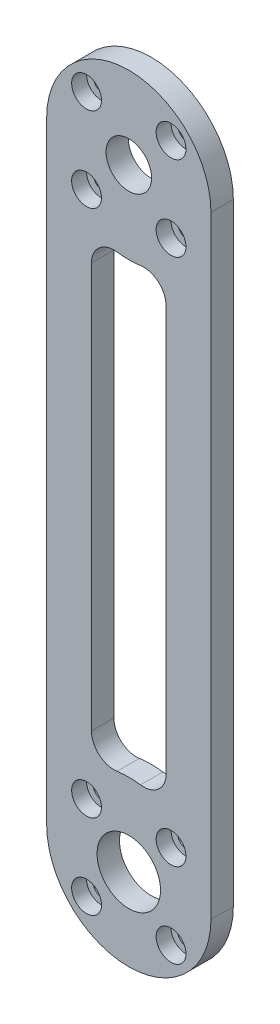
ISO-10303-21;
HEADER;
FILE_DESCRIPTION(('STEP AP214'),'2;1');
FILE_NAME('part.step','',(''),(''),'','','');
FILE_SCHEMA(('AUTOMOTIVE_DESIGN { 1 0 10303 214 1 1 1 1 }'));
ENDSEC;
DATA;
#1=APPLICATION_CONTEXT('core data for automotive mechanical design processes');
#2=APPLICATION_PROTOCOL_DEFINITION('international standard','automotive_design',2000,#1);
#3=PRODUCT_CONTEXT('',#1,'mechanical');
#4=PRODUCT('Part','Part','',(#3));
#5=PRODUCT_RELATED_PRODUCT_CATEGORY('part','',(#4));
#6=PRODUCT_DEFINITION_FORMATION('','',#4);
#7=PRODUCT_DEFINITION_CONTEXT('part definition',#1,'design');
#8=PRODUCT_DEFINITION('design','',#6,#7);
#9=PRODUCT_DEFINITION_SHAPE('','',#8);
#10=(LENGTH_UNIT() NAMED_UNIT(*) SI_UNIT(.MILLI.,.METRE.));
#11=(NAMED_UNIT(*) PLANE_ANGLE_UNIT() SI_UNIT($,.RADIAN.));
#12=(NAMED_UNIT(*) SI_UNIT($,.STERADIAN.) SOLID_ANGLE_UNIT());
#13=UNCERTAINTY_MEASURE_WITH_UNIT(LENGTH_MEASURE(1.E-05),#10,'distance_accuracy_value','');
#14=(GEOMETRIC_REPRESENTATION_CONTEXT(3) GLOBAL_UNCERTAINTY_ASSIGNED_CONTEXT((#13)) GLOBAL_UNIT_ASSIGNED_CONTEXT((#10,
#11,#12)) REPRESENTATION_CONTEXT('',''));
#15=CARTESIAN_POINT('',(0.,0.,0.));
#16=DIRECTION('',(0.,0.,1.));
#17=DIRECTION('',(1.,0.,0.));
#18=AXIS2_PLACEMENT_3D('',#15,#16,#17);
#19=CARTESIAN_POINT('',(5.65685424949247,35.3431457505077,-8.62670273047587));
#20=DIRECTION('',(0.,0.,1.));
#21=DIRECTION('',(1.,0.,0.));
#22=AXIS2_PLACEMENT_3D('',#19,#20,#21);
#23=CYLINDRICAL_SURFACE('',#22,1.);
#24=CARTESIAN_POINT('',(5.65685424949247,35.3431457505077,0.));
#25=DIRECTION('',(0.,0.,1.));
#26=DIRECTION('',(1.,0.,0.));
#27=AXIS2_PLACEMENT_3D('',#24,#25,#26);
#28=CIRCLE('',#27,1.);
#29=CARTESIAN_POINT('',(6.65685424949247,35.3431457505077,0.));
#30=VERTEX_POINT('',#29);
#31=EDGE_CURVE('E423',#30,#30,#28,.F.);
#32=ORIENTED_EDGE('',*,*,#31,.T.);
#33=EDGE_LOOP('',(#32));
#34=FACE_BOUND('',#33,.T.);
#35=CARTESIAN_POINT('',(5.65685424949247,35.3431457505077,1.));
#36=DIRECTION('',(0.,0.,1.));
#37=DIRECTION('',(1.,0.,0.));
#38=AXIS2_PLACEMENT_3D('',#35,#36,#37);
#39=CIRCLE('',#38,1.);
#40=CARTESIAN_POINT('',(6.65685424949247,35.3431457505077,1.));
#41=VERTEX_POINT('',#40);
#42=EDGE_CURVE('E433',#41,#41,#39,.F.);
#43=ORIENTED_EDGE('',*,*,#42,.F.);
#44=EDGE_LOOP('',(#43));
#45=FACE_BOUND('',#44,.T.);
#46=ADVANCED_FACE('F38',(#34,#45),#23,.F.);
#47=CARTESIAN_POINT('',(-5.65685424949235,35.3431457505076,-8.62670273047587));
#48=DIRECTION('',(0.,0.,1.));
#49=DIRECTION('',(1.,0.,0.));
#50=AXIS2_PLACEMENT_3D('',#47,#48,#49);
#51=CYLINDRICAL_SURFACE('',#50,1.);
#52=CARTESIAN_POINT('',(-5.65685424949235,35.3431457505076,0.));
#53=DIRECTION('',(0.,0.,1.));
#54=DIRECTION('',(1.,0.,0.));
#55=AXIS2_PLACEMENT_3D('',#52,#53,#54);
#56=CIRCLE('',#55,1.);
#57=CARTESIAN_POINT('',(-4.65685424949235,35.3431457505076,0.));
#58=VERTEX_POINT('',#57);
#59=EDGE_CURVE('E420',#58,#58,#56,.F.);
#60=ORIENTED_EDGE('',*,*,#59,.T.);
#61=EDGE_LOOP('',(#60));
#62=FACE_BOUND('',#61,.T.);
#63=CARTESIAN_POINT('',(-5.65685424949235,35.3431457505076,1.));
#64=DIRECTION('',(0.,0.,1.));
#65=DIRECTION('',(1.,0.,0.));
#66=AXIS2_PLACEMENT_3D('',#63,#64,#65);
#67=CIRCLE('',#66,1.);
#68=CARTESIAN_POINT('',(-4.65685424949235,35.3431457505076,1.));
#69=VERTEX_POINT('',#68);
#70=EDGE_CURVE('E431',#69,#69,#67,.F.);
#71=ORIENTED_EDGE('',*,*,#70,.F.);
#72=EDGE_LOOP('',(#71));
#73=FACE_BOUND('',#72,.T.);
#74=ADVANCED_FACE('F259',(#62,#73),#51,.F.);
#75=CARTESIAN_POINT('',(-5.65685424949244,46.6568542494923,-8.62670273047587));
#76=DIRECTION('',(0.,0.,1.));
#77=DIRECTION('',(1.,0.,0.));
#78=AXIS2_PLACEMENT_3D('',#75,#76,#77);
#79=CYLINDRICAL_SURFACE('',#78,1.);
#80=CARTESIAN_POINT('',(-5.65685424949244,46.6568542494923,0.));
#81=DIRECTION('',(0.,0.,1.));
#82=DIRECTION('',(1.,0.,0.));
#83=AXIS2_PLACEMENT_3D('',#80,#81,#82);
#84=CIRCLE('',#83,1.);
#85=CARTESIAN_POINT('',(-4.65685424949244,46.6568542494923,0.));
#86=VERTEX_POINT('',#85);
#87=EDGE_CURVE('E417',#86,#86,#84,.F.);
#88=ORIENTED_EDGE('',*,*,#87,.T.);
#89=EDGE_LOOP('',(#88));
#90=FACE_BOUND('',#89,.T.);
#91=CARTESIAN_POINT('',(-5.65685424949244,46.6568542494923,1.));
#92=DIRECTION('',(0.,0.,1.));
#93=DIRECTION('',(1.,0.,0.));
#94=AXIS2_PLACEMENT_3D('',#91,#92,#93);
#95=CIRCLE('',#94,1.);
#96=CARTESIAN_POINT('',(-4.65685424949244,46.6568542494923,1.));
#97=VERTEX_POINT('',#96);
#98=EDGE_CURVE('E441',#97,#97,#95,.F.);
#99=ORIENTED_EDGE('',*,*,#98,.F.);
#100=EDGE_LOOP('',(#99));
#101=FACE_BOUND('',#100,.T.);
#102=ADVANCED_FACE('F265',(#90,#101),#79,.F.);
#103=CARTESIAN_POINT('',(5.65685424949234,46.6568542494924,-8.62670273047587));
#104=DIRECTION('',(0.,0.,1.));
#105=DIRECTION('',(1.,0.,0.));
#106=AXIS2_PLACEMENT_3D('',#103,#104,#105);
#107=CYLINDRICAL_SURFACE('',#106,1.);
#108=CARTESIAN_POINT('',(5.65685424949234,46.6568542494924,0.));
#109=DIRECTION('',(0.,0.,1.));
#110=DIRECTION('',(1.,0.,0.));
#111=AXIS2_PLACEMENT_3D('',#108,#109,#110);
#112=CIRCLE('',#111,1.);
#113=CARTESIAN_POINT('',(6.65685424949234,46.6568542494924,0.));
#114=VERTEX_POINT('',#113);
#115=EDGE_CURVE('E383',#114,#114,#112,.F.);
#116=ORIENTED_EDGE('',*,*,#115,.T.);
#117=EDGE_LOOP('',(#116));
#118=FACE_BOUND('',#117,.T.);
#119=CARTESIAN_POINT('',(5.65685424949234,46.6568542494924,1.));
#120=DIRECTION('',(0.,0.,1.));
#121=DIRECTION('',(1.,0.,0.));
#122=AXIS2_PLACEMENT_3D('',#119,#120,#121);
#123=CIRCLE('',#122,1.);
#124=CARTESIAN_POINT('',(6.65685424949234,46.6568542494924,1.));
#125=VERTEX_POINT('',#124);
#126=EDGE_CURVE('E414',#125,#125,#123,.F.);
#127=ORIENTED_EDGE('',*,*,#126,.F.);
#128=EDGE_LOOP('',(#127));
#129=FACE_BOUND('',#128,.T.);
#130=ADVANCED_FACE('F283',(#118,#129),#107,.F.);
#131=CARTESIAN_POINT('',(-5.65685424949239,-46.6568542494924,-12.0208152801713));
#132=DIRECTION('',(0.,0.,1.));
#133=DIRECTION('',(1.,0.,0.));
#134=AXIS2_PLACEMENT_3D('',#131,#132,#133);
#135=CYLINDRICAL_SURFACE('',#134,1.1);
#136=CARTESIAN_POINT('',(-5.65685424949239,-46.6568542494924,0.));
#137=DIRECTION('',(0.,0.,1.));
#138=DIRECTION('',(1.,0.,0.));
#139=AXIS2_PLACEMENT_3D('',#136,#137,#138);
#140=CIRCLE('',#139,1.1);
#141=CARTESIAN_POINT('',(-4.55685424949239,-46.6568542494924,0.));
#142=VERTEX_POINT('',#141);
#143=EDGE_CURVE('E369',#142,#142,#140,.F.);
#144=ORIENTED_EDGE('',*,*,#143,.T.);
#145=EDGE_LOOP('',(#144));
#146=FACE_BOUND('',#145,.T.);
#147=CARTESIAN_POINT('',(-5.65685424949239,-46.6568542494924,1.));
#148=DIRECTION('',(0.,0.,1.));
#149=DIRECTION('',(1.,0.,0.));
#150=AXIS2_PLACEMENT_3D('',#147,#148,#149);
#151=CIRCLE('',#150,1.1);
#152=CARTESIAN_POINT('',(-4.55685424949239,-46.6568542494924,1.));
#153=VERTEX_POINT('',#152);
#154=EDGE_CURVE('E386',#153,#153,#151,.F.);
#155=ORIENTED_EDGE('',*,*,#154,.F.);
#156=EDGE_LOOP('',(#155));
#157=FACE_BOUND('',#156,.T.);
#158=ADVANCED_FACE('F286',(#146,#157),#135,.F.);
#159=CARTESIAN_POINT('',(5.65685424949235,-46.6568542494924,-12.0208152801713));
#160=DIRECTION('',(0.,0.,1.));
#161=DIRECTION('',(1.,0.,0.));
#162=AXIS2_PLACEMENT_3D('',#159,#160,#161);
#163=CYLINDRICAL_SURFACE('',#162,1.1);
#164=CARTESIAN_POINT('',(5.65685424949235,-46.6568542494924,0.));
#165=DIRECTION('',(0.,0.,1.));
#166=DIRECTION('',(1.,0.,0.));
#167=AXIS2_PLACEMENT_3D('',#164,#165,#166);
#168=CIRCLE('',#167,1.1);
#169=CARTESIAN_POINT('',(6.75685424949234,-46.6568542494924,0.));
#170=VERTEX_POINT('',#169);
#171=EDGE_CURVE('E364',#170,#170,#168,.F.);
#172=ORIENTED_EDGE('',*,*,#171,.T.);
#173=EDGE_LOOP('',(#172));
#174=FACE_BOUND('',#173,.T.);
#175=CARTESIAN_POINT('',(5.65685424949235,-46.6568542494924,1.));
#176=DIRECTION('',(0.,0.,1.));
#177=DIRECTION('',(1.,0.,0.));
#178=AXIS2_PLACEMENT_3D('',#175,#176,#177);
#179=CIRCLE('',#178,1.1);
#180=CARTESIAN_POINT('',(6.75685424949234,-46.6568542494924,1.));
#181=VERTEX_POINT('',#180);
#182=EDGE_CURVE('E370',#181,#181,#179,.F.);
#183=ORIENTED_EDGE('',*,*,#182,.F.);
#184=EDGE_LOOP('',(#183));
#185=FACE_BOUND('',#184,.T.);
#186=ADVANCED_FACE('F318',(#174,#185),#163,.F.);
#187=CARTESIAN_POINT('',(-5.65685424949231,-35.3431457505076,-12.0208152801713));
#188=DIRECTION('',(0.,0.,1.));
#189=DIRECTION('',(1.,0.,0.));
#190=AXIS2_PLACEMENT_3D('',#187,#188,#189);
#191=CYLINDRICAL_SURFACE('',#190,1.1);
#192=CARTESIAN_POINT('',(-5.65685424949231,-35.3431457505076,0.));
#193=DIRECTION('',(0.,0.,1.));
#194=DIRECTION('',(1.,0.,0.));
#195=AXIS2_PLACEMENT_3D('',#192,#193,#194);
#196=CIRCLE('',#195,1.1);
#197=CARTESIAN_POINT('',(-4.55685424949231,-35.3431457505076,0.));
#198=VERTEX_POINT('',#197);
#199=EDGE_CURVE('E366',#198,#198,#196,.F.);
#200=ORIENTED_EDGE('',*,*,#199,.T.);
#201=EDGE_LOOP('',(#200));
#202=FACE_BOUND('',#201,.T.);
#203=CARTESIAN_POINT('',(-5.65685424949231,-35.3431457505076,1.));
#204=DIRECTION('',(0.,0.,1.));
#205=DIRECTION('',(1.,0.,0.));
#206=AXIS2_PLACEMENT_3D('',#203,#204,#205);
#207=CIRCLE('',#206,1.1);
#208=CARTESIAN_POINT('',(-4.55685424949231,-35.3431457505076,1.));
#209=VERTEX_POINT('',#208);
#210=EDGE_CURVE('E375',#209,#209,#207,.F.);
#211=ORIENTED_EDGE('',*,*,#210,.F.);
#212=EDGE_LOOP('',(#211));
#213=FACE_BOUND('',#212,.T.);
#214=ADVANCED_FACE('F322',(#202,#213),#191,.F.);
#215=CARTESIAN_POINT('',(5.65685424949239,-35.3431457505076,-12.0208152801713));
#216=DIRECTION('',(0.,0.,1.));
#217=DIRECTION('',(1.,0.,0.));
#218=AXIS2_PLACEMENT_3D('',#215,#216,#217);
#219=CYLINDRICAL_SURFACE('',#218,1.1);
#220=CARTESIAN_POINT('',(5.65685424949239,-35.3431457505076,0.));
#221=DIRECTION('',(0.,0.,1.));
#222=DIRECTION('',(1.,0.,0.));
#223=AXIS2_PLACEMENT_3D('',#220,#221,#222);
#224=CIRCLE('',#223,1.1);
#225=CARTESIAN_POINT('',(6.75685424949239,-35.3431457505076,0.));
#226=VERTEX_POINT('',#225);
#227=EDGE_CURVE('E218',#226,#226,#224,.F.);
#228=ORIENTED_EDGE('',*,*,#227,.T.);
#229=EDGE_LOOP('',(#228));
#230=FACE_BOUND('',#229,.T.);
#231=CARTESIAN_POINT('',(5.65685424949239,-35.3431457505076,1.));
#232=DIRECTION('',(0.,0.,1.));
#233=DIRECTION('',(1.,0.,0.));
#234=AXIS2_PLACEMENT_3D('',#231,#232,#233);
#235=CIRCLE('',#234,1.1);
#236=CARTESIAN_POINT('',(6.75685424949239,-35.3431457505076,1.));
#237=VERTEX_POINT('',#236);
#238=EDGE_CURVE('E345',#237,#237,#235,.F.);
#239=ORIENTED_EDGE('',*,*,#238,.F.);
#240=EDGE_LOOP('',(#239));
#241=FACE_BOUND('',#240,.T.);
#242=ADVANCED_FACE('F326',(#230,#241),#219,.F.);
#243=CARTESIAN_POINT('',(0.,41.,3.));
#244=DIRECTION('',(0.,0.,-1.));
#245=DIRECTION('',(-1.,0.,0.));
#246=AXIS2_PLACEMENT_3D('',#243,#244,#245);
#247=CYLINDRICAL_SURFACE('',#246,11.);
#248=CARTESIAN_POINT('',(0.,41.,0.));
#249=DIRECTION('',(0.,0.,1.));
#250=DIRECTION('',(1.,0.,0.));
#251=AXIS2_PLACEMENT_3D('',#248,#249,#250);
#252=CIRCLE('',#251,11.);
#253=CARTESIAN_POINT('',(11.,41.,0.));
#254=VERTEX_POINT('',#253);
#255=CARTESIAN_POINT('',(-11.,41.,0.));
#256=VERTEX_POINT('',#255);
#257=EDGE_CURVE('E151',#254,#256,#252,.T.);
#258=ORIENTED_EDGE('',*,*,#257,.T.);
#259=DIRECTION('',(0.,0.,-1.));
#260=VECTOR('',#259,1.);
#261=CARTESIAN_POINT('',(-11.,41.,3.));
#262=LINE('',#261,#260);
#263=CARTESIAN_POINT('',(-11.,41.,3.));
#264=VERTEX_POINT('',#263);
#265=EDGE_CURVE('E132',#264,#256,#262,.T.);
#266=ORIENTED_EDGE('',*,*,#265,.F.);
#267=CARTESIAN_POINT('',(0.,41.,3.));
#268=DIRECTION('',(0.,0.,1.));
#269=DIRECTION('',(1.,0.,0.));
#270=AXIS2_PLACEMENT_3D('',#267,#268,#269);
#271=CIRCLE('',#270,11.);
#272=CARTESIAN_POINT('',(11.,41.,3.));
#273=VERTEX_POINT('',#272);
#274=EDGE_CURVE('E139',#273,#264,#271,.T.);
#275=ORIENTED_EDGE('',*,*,#274,.F.);
#276=DIRECTION('',(0.,0.,-1.));
#277=VECTOR('',#276,1.);
#278=CARTESIAN_POINT('',(11.,41.,3.));
#279=LINE('',#278,#277);
#280=EDGE_CURVE('E224',#273,#254,#279,.T.);
#281=ORIENTED_EDGE('',*,*,#280,.T.);
#282=EDGE_LOOP('',(#258,#266,#275,#281));
#283=FACE_BOUND('',#282,.T.);
#284=ADVANCED_FACE('F149',(#283),#247,.T.);
#285=CARTESIAN_POINT('',(-11.,0.,3.));
#286=DIRECTION('',(1.,0.,0.));
#287=DIRECTION('',(0.,1.,0.));
#288=AXIS2_PLACEMENT_3D('',#285,#286,#287);
#289=PLANE('',#288);
#290=DIRECTION('',(0.,-1.,0.));
#291=VECTOR('',#290,1.);
#292=CARTESIAN_POINT('',(-11.,0.,0.));
#293=LINE('',#292,#291);
#294=CARTESIAN_POINT('',(-11.,-41.,0.));
#295=VERTEX_POINT('',#294);
#296=EDGE_CURVE('E232',#256,#295,#293,.T.);
#297=ORIENTED_EDGE('',*,*,#296,.T.);
#298=DIRECTION('',(0.,0.,-1.));
#299=VECTOR('',#298,1.);
#300=CARTESIAN_POINT('',(-11.,-41.,3.));
#301=LINE('',#300,#299);
#302=CARTESIAN_POINT('',(-11.,-41.,3.));
#303=VERTEX_POINT('',#302);
#304=EDGE_CURVE('E135',#303,#295,#301,.T.);
#305=ORIENTED_EDGE('',*,*,#304,.F.);
#306=DIRECTION('',(0.,-1.,0.));
#307=VECTOR('',#306,1.);
#308=CARTESIAN_POINT('',(-11.,0.,3.));
#309=LINE('',#308,#307);
#310=EDGE_CURVE('E128',#264,#303,#309,.T.);
#311=ORIENTED_EDGE('',*,*,#310,.F.);
#312=ORIENTED_EDGE('',*,*,#265,.T.);
#313=EDGE_LOOP('',(#297,#305,#311,#312));
#314=FACE_BOUND('',#313,.T.);
#315=ADVANCED_FACE('F130',(#314),#289,.F.);
#316=CARTESIAN_POINT('',(0.,-41.,3.));
#317=DIRECTION('',(0.,0.,-1.));
#318=DIRECTION('',(-1.,0.,0.));
#319=AXIS2_PLACEMENT_3D('',#316,#317,#318);
#320=CYLINDRICAL_SURFACE('',#319,11.);
#321=CARTESIAN_POINT('',(0.,-41.,0.));
#322=DIRECTION('',(0.,0.,1.));
#323=DIRECTION('',(1.,0.,0.));
#324=AXIS2_PLACEMENT_3D('',#321,#322,#323);
#325=CIRCLE('',#324,11.);
#326=CARTESIAN_POINT('',(11.,-41.,0.));
#327=VERTEX_POINT('',#326);
#328=EDGE_CURVE('E215',#295,#327,#325,.T.);
#329=ORIENTED_EDGE('',*,*,#328,.T.);
#330=DIRECTION('',(0.,0.,-1.));
#331=VECTOR('',#330,1.);
#332=CARTESIAN_POINT('',(11.,-41.,3.));
#333=LINE('',#332,#331);
#334=CARTESIAN_POINT('',(11.,-41.,3.));
#335=VERTEX_POINT('',#334);
#336=EDGE_CURVE('E156',#335,#327,#333,.T.);
#337=ORIENTED_EDGE('',*,*,#336,.F.);
#338=CARTESIAN_POINT('',(0.,-41.,3.));
#339=DIRECTION('',(0.,0.,1.));
#340=DIRECTION('',(1.,0.,0.));
#341=AXIS2_PLACEMENT_3D('',#338,#339,#340);
#342=CIRCLE('',#341,11.);
#343=EDGE_CURVE('E138',#303,#335,#342,.T.);
#344=ORIENTED_EDGE('',*,*,#343,.F.);
#345=ORIENTED_EDGE('',*,*,#304,.T.);
#346=EDGE_LOOP('',(#329,#337,#344,#345));
#347=FACE_BOUND('',#346,.T.);
#348=ADVANCED_FACE('F241',(#347),#320,.T.);
#349=CARTESIAN_POINT('',(5.,0.,3.));
#350=DIRECTION('',(1.,0.,0.));
#351=DIRECTION('',(0.,1.,0.));
#352=AXIS2_PLACEMENT_3D('',#349,#350,#351);
#353=PLANE('',#352);
#354=DIRECTION('',(0.,-1.,0.));
#355=VECTOR('',#354,1.);
#356=CARTESIAN_POINT('',(5.,0.,0.));
#357=LINE('',#356,#355);
#358=CARTESIAN_POINT('',(5.,27.143593539449,0.));
#359=VERTEX_POINT('',#358);
#360=CARTESIAN_POINT('',(5.,-27.143593539449,0.));
#361=VERTEX_POINT('',#360);
#362=EDGE_CURVE('E193',#359,#361,#357,.T.);
#363=ORIENTED_EDGE('',*,*,#362,.T.);
#364=DIRECTION('',(0.,0.,1.));
#365=VECTOR('',#364,1.);
#366=CARTESIAN_POINT('',(5.,-27.143593539449,3.));
#367=LINE('',#366,#365);
#368=CARTESIAN_POINT('',(5.,-27.143593539449,3.));
#369=VERTEX_POINT('',#368);
#370=EDGE_CURVE('E170',#361,#369,#367,.T.);
#371=ORIENTED_EDGE('',*,*,#370,.T.);
#372=DIRECTION('',(0.,-1.,0.));
#373=VECTOR('',#372,1.);
#374=CARTESIAN_POINT('',(5.,0.,3.));
#375=LINE('',#374,#373);
#376=CARTESIAN_POINT('',(5.,27.143593539449,3.));
#377=VERTEX_POINT('',#376);
#378=EDGE_CURVE('E203',#377,#369,#375,.T.);
#379=ORIENTED_EDGE('',*,*,#378,.F.);
#380=DIRECTION('',(0.,0.,1.));
#381=VECTOR('',#380,1.);
#382=CARTESIAN_POINT('',(5.,27.143593539449,0.));
#383=LINE('',#382,#381);
#384=EDGE_CURVE('E167',#377,#359,#383,.F.);
#385=ORIENTED_EDGE('',*,*,#384,.T.);
#386=EDGE_LOOP('',(#363,#371,#379,#385));
#387=FACE_BOUND('',#386,.T.);
#388=ADVANCED_FACE('F206',(#387),#353,.F.);
#389=CARTESIAN_POINT('',(1.57142857142857,-30.1128234952813,0.));
#390=VERTEX_POINT('',#389);
#391=CARTESIAN_POINT('',(-1.57142857142858,-30.1128234952813,0.));
#392=VERTEX_POINT('',#391);
#393=EDGE_CURVE('E226',#390,#392,#325,.T.);
#394=ORIENTED_EDGE('',*,*,#393,.T.);
#395=DIRECTION('',(0.,0.,-1.));
#396=VECTOR('',#395,1.);
#397=CARTESIAN_POINT('',(-1.57142857142857,-30.1128234952813,3.));
#398=LINE('',#397,#396);
#399=CARTESIAN_POINT('',(-1.57142857142858,-30.1128234952813,3.));
#400=VERTEX_POINT('',#399);
#401=EDGE_CURVE('E165',#392,#400,#398,.F.);
#402=ORIENTED_EDGE('',*,*,#401,.T.);
#403=CARTESIAN_POINT('',(1.57142857142857,-30.1128234952813,3.));
#404=VERTEX_POINT('',#403);
#405=EDGE_CURVE('E208',#404,#400,#342,.T.);
#406=ORIENTED_EDGE('',*,*,#405,.F.);
#407=DIRECTION('',(0.,0.,-1.));
#408=VECTOR('',#407,1.);
#409=CARTESIAN_POINT('',(1.57142857142857,-30.1128234952813,3.));
#410=LINE('',#409,#408);
#411=EDGE_CURVE('E162',#404,#390,#410,.T.);
#412=ORIENTED_EDGE('',*,*,#411,.T.);
#413=EDGE_LOOP('',(#394,#402,#406,#412));
#414=FACE_BOUND('',#413,.T.);
#415=ADVANCED_FACE('F667',(#414),#320,.T.);
#416=CARTESIAN_POINT('',(-5.00000000000001,0.,3.));
#417=DIRECTION('',(1.,0.,0.));
#418=DIRECTION('',(0.,1.,0.));
#419=AXIS2_PLACEMENT_3D('',#416,#417,#418);
#420=PLANE('',#419);
#421=DIRECTION('',(0.,-1.,0.));
#422=VECTOR('',#421,1.);
#423=CARTESIAN_POINT('',(-5.00000000000001,0.,3.));
#424=LINE('',#423,#422);
#425=CARTESIAN_POINT('',(-5.00000000000001,27.143593539449,3.));
#426=VERTEX_POINT('',#425);
#427=CARTESIAN_POINT('',(-5.,-27.143593539449,3.));
#428=VERTEX_POINT('',#427);
#429=EDGE_CURVE('E212',#426,#428,#424,.T.);
#430=ORIENTED_EDGE('',*,*,#429,.T.);
#431=DIRECTION('',(0.,0.,-1.));
#432=VECTOR('',#431,1.);
#433=CARTESIAN_POINT('',(-5.,-27.143593539449,3.));
#434=LINE('',#433,#432);
#435=CARTESIAN_POINT('',(-5.,-27.143593539449,0.));
#436=VERTEX_POINT('',#435);
#437=EDGE_CURVE('E154',#428,#436,#434,.T.);
#438=ORIENTED_EDGE('',*,*,#437,.T.);
#439=DIRECTION('',(0.,-1.,0.));
#440=VECTOR('',#439,1.);
#441=CARTESIAN_POINT('',(-5.00000000000001,0.,0.));
#442=LINE('',#441,#440);
#443=CARTESIAN_POINT('',(-5.00000000000001,27.143593539449,0.));
#444=VERTEX_POINT('',#443);
#445=EDGE_CURVE('E198',#444,#436,#442,.T.);
#446=ORIENTED_EDGE('',*,*,#445,.F.);
#447=DIRECTION('',(0.,0.,-1.));
#448=VECTOR('',#447,1.);
#449=CARTESIAN_POINT('',(-5.00000000000001,27.143593539449,3.));
#450=LINE('',#449,#448);
#451=EDGE_CURVE('E152',#444,#426,#450,.F.);
#452=ORIENTED_EDGE('',*,*,#451,.T.);
#453=EDGE_LOOP('',(#430,#438,#446,#452));
#454=FACE_BOUND('',#453,.T.);
#455=ADVANCED_FACE('F668',(#454),#420,.T.);
#456=CARTESIAN_POINT('',(-1.57142857142858,30.1128234952813,3.));
#457=VERTEX_POINT('',#456);
#458=CARTESIAN_POINT('',(1.57142857142857,30.1128234952813,3.));
#459=VERTEX_POINT('',#458);
#460=EDGE_CURVE('E147',#457,#459,#271,.T.);
#461=ORIENTED_EDGE('',*,*,#460,.F.);
#462=DIRECTION('',(0.,0.,-1.));
#463=VECTOR('',#462,1.);
#464=CARTESIAN_POINT('',(-1.57142857142858,30.1128234952813,3.));
#465=LINE('',#464,#463);
#466=CARTESIAN_POINT('',(-1.57142857142858,30.1128234952813,0.));
#467=VERTEX_POINT('',#466);
#468=EDGE_CURVE('E173',#457,#467,#465,.T.);
#469=ORIENTED_EDGE('',*,*,#468,.T.);
#470=CARTESIAN_POINT('',(1.57142857142857,30.1128234952813,0.));
#471=VERTEX_POINT('',#470);
#472=EDGE_CURVE('E191',#467,#471,#252,.T.);
#473=ORIENTED_EDGE('',*,*,#472,.T.);
#474=DIRECTION('',(0.,0.,-1.));
#475=VECTOR('',#474,1.);
#476=CARTESIAN_POINT('',(1.57142857142857,30.1128234952813,3.));
#477=LINE('',#476,#475);
#478=EDGE_CURVE('E53',#471,#459,#477,.F.);
#479=ORIENTED_EDGE('',*,*,#478,.T.);
#480=EDGE_LOOP('',(#461,#469,#473,#479));
#481=FACE_BOUND('',#480,.T.);
#482=ADVANCED_FACE('F196',(#481),#247,.T.);
#483=CARTESIAN_POINT('',(11.,0.,3.));
#484=DIRECTION('',(1.,0.,0.));
#485=DIRECTION('',(0.,1.,0.));
#486=AXIS2_PLACEMENT_3D('',#483,#484,#485);
#487=PLANE('',#486);
#488=DIRECTION('',(0.,-1.,0.));
#489=VECTOR('',#488,1.);
#490=CARTESIAN_POINT('',(11.,0.,0.));
#491=LINE('',#490,#489);
#492=EDGE_CURVE('E209',#254,#327,#491,.T.);
#493=ORIENTED_EDGE('',*,*,#492,.F.);
#494=ORIENTED_EDGE('',*,*,#280,.F.);
#495=DIRECTION('',(0.,-1.,0.));
#496=VECTOR('',#495,1.);
#497=CARTESIAN_POINT('',(11.,0.,3.));
#498=LINE('',#497,#496);
#499=EDGE_CURVE('E145',#273,#335,#498,.T.);
#500=ORIENTED_EDGE('',*,*,#499,.T.);
#501=ORIENTED_EDGE('',*,*,#336,.T.);
#502=EDGE_LOOP('',(#493,#494,#500,#501));
#503=FACE_BOUND('',#502,.T.);
#504=ADVANCED_FACE('F238',(#503),#487,.T.);
#505=CARTESIAN_POINT('',(0.,0.,3.));
#506=DIRECTION('',(0.,0.,1.));
#507=DIRECTION('',(1.,0.,0.));
#508=AXIS2_PLACEMENT_3D('',#505,#506,#507);
#509=PLANE('',#508);
#510=CARTESIAN_POINT('',(-5.65685424949244,46.6568542494923,3.));
#511=DIRECTION('',(0.,0.,1.));
#512=DIRECTION('',(0.,1.,0.));
#513=AXIS2_PLACEMENT_3D('',#510,#511,#512);
#514=CIRCLE('',#513,2.00000000000001);
#515=CARTESIAN_POINT('',(-5.65685424949245,48.6568542494923,3.));
#516=VERTEX_POINT('',#515);
#517=EDGE_CURVE('E449',#516,#516,#514,.T.);
#518=ORIENTED_EDGE('',*,*,#517,.F.);
#519=EDGE_LOOP('',(#518));
#520=FACE_BOUND('',#519,.T.);
#521=CARTESIAN_POINT('',(-5.65685424949235,35.3431457505076,3.));
#522=DIRECTION('',(0.,0.,1.));
#523=DIRECTION('',(-1.,0.,0.));
#524=AXIS2_PLACEMENT_3D('',#521,#522,#523);
#525=CIRCLE('',#524,2.00000000000001);
#526=CARTESIAN_POINT('',(-7.65685424949236,35.3431457505076,3.));
#527=VERTEX_POINT('',#526);
#528=EDGE_CURVE('E442',#527,#527,#525,.T.);
#529=ORIENTED_EDGE('',*,*,#528,.F.);
#530=EDGE_LOOP('',(#529));
#531=FACE_BOUND('',#530,.T.);
#532=CARTESIAN_POINT('',(5.65685424949247,35.3431457505077,3.));
#533=DIRECTION('',(0.,0.,1.));
#534=DIRECTION('',(0.,-1.,0.));
#535=AXIS2_PLACEMENT_3D('',#532,#533,#534);
#536=CIRCLE('',#535,2.00000000000001);
#537=CARTESIAN_POINT('',(5.65685424949249,33.3431457505077,3.));
#538=VERTEX_POINT('',#537);
#539=EDGE_CURVE('E432',#538,#538,#536,.T.);
#540=ORIENTED_EDGE('',*,*,#539,.F.);
#541=EDGE_LOOP('',(#540));
#542=FACE_BOUND('',#541,.T.);
#543=CARTESIAN_POINT('',(5.65685424949234,46.6568542494924,3.));
#544=DIRECTION('',(0.,0.,1.));
#545=DIRECTION('',(1.,0.,0.));
#546=AXIS2_PLACEMENT_3D('',#543,#544,#545);
#547=CIRCLE('',#546,2.00000000000001);
#548=CARTESIAN_POINT('',(7.65685424949235,46.6568542494924,3.));
#549=VERTEX_POINT('',#548);
#550=EDGE_CURVE('E413',#549,#549,#547,.T.);
#551=ORIENTED_EDGE('',*,*,#550,.F.);
#552=EDGE_LOOP('',(#551));
#553=FACE_BOUND('',#552,.T.);
#554=CARTESIAN_POINT('',(0.,41.,3.));
#555=DIRECTION('',(0.,0.,1.));
#556=DIRECTION('',(1.,0.,0.));
#557=AXIS2_PLACEMENT_3D('',#554,#555,#556);
#558=CIRCLE('',#557,3.05);
#559=CARTESIAN_POINT('',(3.04999999999999,41.,3.));
#560=VERTEX_POINT('',#559);
#561=EDGE_CURVE('E405',#560,#560,#558,.T.);
#562=ORIENTED_EDGE('',*,*,#561,.F.);
#563=EDGE_LOOP('',(#562));
#564=FACE_BOUND('',#563,.T.);
#565=CARTESIAN_POINT('',(5.65685424949235,-46.6568542494924,3.));
#566=DIRECTION('',(0.,0.,1.));
#567=DIRECTION('',(0.,-1.,0.));
#568=AXIS2_PLACEMENT_3D('',#565,#566,#567);
#569=CIRCLE('',#568,2.);
#570=CARTESIAN_POINT('',(5.65685424949234,-48.6568542494924,3.));
#571=VERTEX_POINT('',#570);
#572=EDGE_CURVE('E389',#571,#571,#569,.T.);
#573=ORIENTED_EDGE('',*,*,#572,.F.);
#574=EDGE_LOOP('',(#573));
#575=FACE_BOUND('',#574,.T.);
#576=CARTESIAN_POINT('',(-5.65685424949239,-46.6568542494924,3.));
#577=DIRECTION('',(0.,0.,1.));
#578=DIRECTION('',(-1.,0.,0.));
#579=AXIS2_PLACEMENT_3D('',#576,#577,#578);
#580=CIRCLE('',#579,2.);
#581=CARTESIAN_POINT('',(-7.65685424949239,-46.6568542494924,3.));
#582=VERTEX_POINT('',#581);
#583=EDGE_CURVE('E378',#582,#582,#580,.T.);
#584=ORIENTED_EDGE('',*,*,#583,.F.);
#585=EDGE_LOOP('',(#584));
#586=FACE_BOUND('',#585,.T.);
#587=CARTESIAN_POINT('',(-5.65685424949231,-35.3431457505076,3.));
#588=DIRECTION('',(0.,0.,1.));
#589=DIRECTION('',(0.,1.,0.));
#590=AXIS2_PLACEMENT_3D('',#587,#588,#589);
#591=CIRCLE('',#590,2.);
#592=CARTESIAN_POINT('',(-5.65685424949228,-33.3431457505076,3.));
#593=VERTEX_POINT('',#592);
#594=EDGE_CURVE('E380',#593,#593,#591,.T.);
#595=ORIENTED_EDGE('',*,*,#594,.F.);
#596=EDGE_LOOP('',(#595));
#597=FACE_BOUND('',#596,.T.);
#598=CARTESIAN_POINT('',(5.65685424949239,-35.3431457505076,3.));
#599=DIRECTION('',(0.,0.,1.));
#600=DIRECTION('',(1.,0.,0.));
#601=AXIS2_PLACEMENT_3D('',#598,#599,#600);
#602=CIRCLE('',#601,2.);
#603=CARTESIAN_POINT('',(7.65685424949239,-35.3431457505076,3.));
#604=VERTEX_POINT('',#603);
#605=EDGE_CURVE('E351',#604,#604,#602,.T.);
#606=ORIENTED_EDGE('',*,*,#605,.F.);
#607=EDGE_LOOP('',(#606));
#608=FACE_BOUND('',#607,.T.);
#609=CARTESIAN_POINT('',(0.,-41.,3.));
#610=DIRECTION('',(0.,0.,1.));
#611=DIRECTION('',(1.,0.,0.));
#612=AXIS2_PLACEMENT_3D('',#609,#610,#611);
#613=CIRCLE('',#612,4.25);
#614=CARTESIAN_POINT('',(4.25,-41.,3.));
#615=VERTEX_POINT('',#614);
#616=EDGE_CURVE('E349',#615,#615,#613,.T.);
#617=ORIENTED_EDGE('',*,*,#616,.F.);
#618=EDGE_LOOP('',(#617));
#619=FACE_BOUND('',#618,.T.);
#620=ORIENTED_EDGE('',*,*,#460,.T.);
#621=CARTESIAN_POINT('',(2.,27.143593539449,3.));
#622=DIRECTION('',(0.,0.,1.));
#623=DIRECTION('',(1.,0.,0.));
#624=AXIS2_PLACEMENT_3D('',#621,#622,#623);
#625=CIRCLE('',#624,3.);
#626=EDGE_CURVE('E12',#459,#377,#625,.F.);
#627=ORIENTED_EDGE('',*,*,#626,.T.);
#628=ORIENTED_EDGE('',*,*,#378,.T.);
#629=CARTESIAN_POINT('',(2.,-27.143593539449,3.));
#630=DIRECTION('',(0.,0.,1.));
#631=DIRECTION('',(1.,0.,0.));
#632=AXIS2_PLACEMENT_3D('',#629,#630,#631);
#633=CIRCLE('',#632,3.);
#634=EDGE_CURVE('E182',#369,#404,#633,.F.);
#635=ORIENTED_EDGE('',*,*,#634,.T.);
#636=ORIENTED_EDGE('',*,*,#405,.T.);
#637=CARTESIAN_POINT('',(-2.,-27.143593539449,3.));
#638=DIRECTION('',(0.,0.,1.));
#639=DIRECTION('',(1.,0.,0.));
#640=AXIS2_PLACEMENT_3D('',#637,#638,#639);
#641=CIRCLE('',#640,3.);
#642=EDGE_CURVE('E178',#400,#428,#641,.F.);
#643=ORIENTED_EDGE('',*,*,#642,.T.);
#644=ORIENTED_EDGE('',*,*,#429,.F.);
#645=CARTESIAN_POINT('',(-2.00000000000001,27.143593539449,3.));
#646=DIRECTION('',(0.,0.,1.));
#647=DIRECTION('',(1.,0.,0.));
#648=AXIS2_PLACEMENT_3D('',#645,#646,#647);
#649=CIRCLE('',#648,3.);
#650=EDGE_CURVE('E60',#426,#457,#649,.F.);
#651=ORIENTED_EDGE('',*,*,#650,.T.);
#652=EDGE_LOOP('',(#620,#627,#628,#635,#636,#643,#644,#651));
#653=FACE_BOUND('',#652,.T.);
#654=ORIENTED_EDGE('',*,*,#274,.T.);
#655=ORIENTED_EDGE('',*,*,#310,.T.);
#656=ORIENTED_EDGE('',*,*,#343,.T.);
#657=ORIENTED_EDGE('',*,*,#499,.F.);
#658=EDGE_LOOP('',(#654,#655,#656,#657));
#659=FACE_BOUND('',#658,.T.);
#660=ADVANCED_FACE('F143',(#520,#531,#542,#553,#564,#575,#586,#597,#608,#619,#653,#659),#509,.T.);
#661=CARTESIAN_POINT('',(0.,0.,0.));
#662=DIRECTION('',(0.,0.,1.));
#663=DIRECTION('',(1.,0.,0.));
#664=AXIS2_PLACEMENT_3D('',#661,#662,#663);
#665=PLANE('',#664);
#666=ORIENTED_EDGE('',*,*,#87,.F.);
#667=EDGE_LOOP('',(#666));
#668=FACE_BOUND('',#667,.T.);
#669=ORIENTED_EDGE('',*,*,#59,.F.);
#670=EDGE_LOOP('',(#669));
#671=FACE_BOUND('',#670,.T.);
#672=ORIENTED_EDGE('',*,*,#31,.F.);
#673=EDGE_LOOP('',(#672));
#674=FACE_BOUND('',#673,.T.);
#675=ORIENTED_EDGE('',*,*,#115,.F.);
#676=EDGE_LOOP('',(#675));
#677=FACE_BOUND('',#676,.T.);
#678=CARTESIAN_POINT('',(0.,41.,0.));
#679=DIRECTION('',(0.,0.,1.));
#680=DIRECTION('',(1.,0.,0.));
#681=AXIS2_PLACEMENT_3D('',#678,#679,#680);
#682=CIRCLE('',#681,3.05);
#683=CARTESIAN_POINT('',(3.04999999999999,41.,0.));
#684=VERTEX_POINT('',#683);
#685=EDGE_CURVE('E402',#684,#684,#682,.F.);
#686=ORIENTED_EDGE('',*,*,#685,.F.);
#687=EDGE_LOOP('',(#686));
#688=FACE_BOUND('',#687,.T.);
#689=ORIENTED_EDGE('',*,*,#199,.F.);
#690=EDGE_LOOP('',(#689));
#691=FACE_BOUND('',#690,.T.);
#692=ORIENTED_EDGE('',*,*,#171,.F.);
#693=EDGE_LOOP('',(#692));
#694=FACE_BOUND('',#693,.T.);
#695=ORIENTED_EDGE('',*,*,#143,.F.);
#696=EDGE_LOOP('',(#695));
#697=FACE_BOUND('',#696,.T.);
#698=CARTESIAN_POINT('',(0.,-41.,0.));
#699=DIRECTION('',(0.,0.,1.));
#700=DIRECTION('',(1.,0.,0.));
#701=AXIS2_PLACEMENT_3D('',#698,#699,#700);
#702=CIRCLE('',#701,4.25);
#703=CARTESIAN_POINT('',(4.25,-41.,0.));
#704=VERTEX_POINT('',#703);
#705=EDGE_CURVE('E227',#704,#704,#702,.F.);
#706=ORIENTED_EDGE('',*,*,#705,.F.);
#707=EDGE_LOOP('',(#706));
#708=FACE_BOUND('',#707,.T.);
#709=ORIENTED_EDGE('',*,*,#227,.F.);
#710=EDGE_LOOP('',(#709));
#711=FACE_BOUND('',#710,.T.);
#712=ORIENTED_EDGE('',*,*,#362,.F.);
#713=CARTESIAN_POINT('',(2.,27.143593539449,0.));
#714=DIRECTION('',(0.,0.,1.));
#715=DIRECTION('',(1.,0.,0.));
#716=AXIS2_PLACEMENT_3D('',#713,#714,#715);
#717=CIRCLE('',#716,3.);
#718=EDGE_CURVE('E46',#359,#471,#717,.T.);
#719=ORIENTED_EDGE('',*,*,#718,.T.);
#720=ORIENTED_EDGE('',*,*,#472,.F.);
#721=CARTESIAN_POINT('',(-2.00000000000001,27.143593539449,0.));
#722=DIRECTION('',(0.,0.,1.));
#723=DIRECTION('',(1.,0.,0.));
#724=AXIS2_PLACEMENT_3D('',#721,#722,#723);
#725=CIRCLE('',#724,3.);
#726=EDGE_CURVE('E184',#467,#444,#725,.T.);
#727=ORIENTED_EDGE('',*,*,#726,.T.);
#728=ORIENTED_EDGE('',*,*,#445,.T.);
#729=CARTESIAN_POINT('',(-2.,-27.143593539449,0.));
#730=DIRECTION('',(0.,0.,1.));
#731=DIRECTION('',(1.,0.,0.));
#732=AXIS2_PLACEMENT_3D('',#729,#730,#731);
#733=CIRCLE('',#732,3.);
#734=EDGE_CURVE('E176',#436,#392,#733,.T.);
#735=ORIENTED_EDGE('',*,*,#734,.T.);
#736=ORIENTED_EDGE('',*,*,#393,.F.);
#737=CARTESIAN_POINT('',(2.,-27.143593539449,0.));
#738=DIRECTION('',(0.,0.,1.));
#739=DIRECTION('',(1.,0.,0.));
#740=AXIS2_PLACEMENT_3D('',#737,#738,#739);
#741=CIRCLE('',#740,3.);
#742=EDGE_CURVE('E180',#390,#361,#741,.T.);
#743=ORIENTED_EDGE('',*,*,#742,.T.);
#744=EDGE_LOOP('',(#712,#719,#720,#727,#728,#735,#736,#743));
#745=FACE_BOUND('',#744,.T.);
#746=ORIENTED_EDGE('',*,*,#257,.F.);
#747=ORIENTED_EDGE('',*,*,#492,.T.);
#748=ORIENTED_EDGE('',*,*,#328,.F.);
#749=ORIENTED_EDGE('',*,*,#296,.F.);
#750=EDGE_LOOP('',(#746,#747,#748,#749));
#751=FACE_BOUND('',#750,.T.);
#752=ADVANCED_FACE('F189',(#668,#671,#674,#677,#688,#691,#694,#697,#708,#711,#745,#751),#665,.F.);
#753=CARTESIAN_POINT('',(0.,-41.,-12.0208152801713));
#754=DIRECTION('',(0.,0.,1.));
#755=DIRECTION('',(1.,0.,0.));
#756=AXIS2_PLACEMENT_3D('',#753,#754,#755);
#757=CYLINDRICAL_SURFACE('',#756,4.25);
#758=ORIENTED_EDGE('',*,*,#705,.T.);
#759=EDGE_LOOP('',(#758));
#760=FACE_BOUND('',#759,.T.);
#761=ORIENTED_EDGE('',*,*,#616,.T.);
#762=EDGE_LOOP('',(#761));
#763=FACE_BOUND('',#762,.T.);
#764=ADVANCED_FACE('F243',(#760,#763),#757,.F.);
#765=CARTESIAN_POINT('',(5.65685424949239,-35.3431457505076,-5.65685424949239));
#766=DIRECTION('',(0.,0.,1.));
#767=DIRECTION('',(1.,0.,0.));
#768=AXIS2_PLACEMENT_3D('',#765,#766,#767);
#769=CYLINDRICAL_SURFACE('',#768,2.);
#770=CARTESIAN_POINT('',(5.65685424949239,-35.3431457505076,1.));
#771=DIRECTION('',(0.,0.,1.));
#772=DIRECTION('',(1.,0.,0.));
#773=AXIS2_PLACEMENT_3D('',#770,#771,#772);
#774=CIRCLE('',#773,2.);
#775=CARTESIAN_POINT('',(7.65685424949239,-35.3431457505076,1.));
#776=VERTEX_POINT('',#775);
#777=EDGE_CURVE('E347',#776,#776,#774,.F.);
#778=ORIENTED_EDGE('',*,*,#777,.T.);
#779=EDGE_LOOP('',(#778));
#780=FACE_BOUND('',#779,.T.);
#781=ORIENTED_EDGE('',*,*,#605,.T.);
#782=EDGE_LOOP('',(#781));
#783=FACE_BOUND('',#782,.T.);
#784=ADVANCED_FACE('F250',(#780,#783),#769,.F.);
#785=CARTESIAN_POINT('',(0.,0.,1.));
#786=DIRECTION('',(0.,0.,1.));
#787=DIRECTION('',(1.,0.,0.));
#788=AXIS2_PLACEMENT_3D('',#785,#786,#787);
#789=PLANE('',#788);
#790=ORIENTED_EDGE('',*,*,#777,.F.);
#791=EDGE_LOOP('',(#790));
#792=FACE_BOUND('',#791,.T.);
#793=ORIENTED_EDGE('',*,*,#238,.T.);
#794=EDGE_LOOP('',(#793));
#795=FACE_BOUND('',#794,.T.);
#796=ADVANCED_FACE('F314',(#792,#795),#789,.T.);
#797=CARTESIAN_POINT('',(-5.65685424949231,-35.3431457505076,-5.65685424949239));
#798=DIRECTION('',(0.,0.,1.));
#799=DIRECTION('',(1.,0.,0.));
#800=AXIS2_PLACEMENT_3D('',#797,#798,#799);
#801=CYLINDRICAL_SURFACE('',#800,2.);
#802=CARTESIAN_POINT('',(-5.65685424949231,-35.3431457505076,1.));
#803=DIRECTION('',(0.,0.,1.));
#804=DIRECTION('',(1.,0.,0.));
#805=AXIS2_PLACEMENT_3D('',#802,#803,#804);
#806=CIRCLE('',#805,2.);
#807=CARTESIAN_POINT('',(-3.6568542494923,-35.3431457505076,1.));
#808=VERTEX_POINT('',#807);
#809=EDGE_CURVE('E379',#808,#808,#806,.F.);
#810=ORIENTED_EDGE('',*,*,#809,.T.);
#811=EDGE_LOOP('',(#810));
#812=FACE_BOUND('',#811,.T.);
#813=ORIENTED_EDGE('',*,*,#594,.T.);
#814=EDGE_LOOP('',(#813));
#815=FACE_BOUND('',#814,.T.);
#816=ADVANCED_FACE('F310',(#812,#815),#801,.F.);
#817=CARTESIAN_POINT('',(0.,0.,1.));
#818=DIRECTION('',(0.,0.,1.));
#819=DIRECTION('',(1.,0.,0.));
#820=AXIS2_PLACEMENT_3D('',#817,#818,#819);
#821=PLANE('',#820);
#822=ORIENTED_EDGE('',*,*,#809,.F.);
#823=EDGE_LOOP('',(#822));
#824=FACE_BOUND('',#823,.T.);
#825=ORIENTED_EDGE('',*,*,#210,.T.);
#826=EDGE_LOOP('',(#825));
#827=FACE_BOUND('',#826,.T.);
#828=ADVANCED_FACE('F300',(#824,#827),#821,.T.);
#829=CARTESIAN_POINT('',(5.65685424949235,-46.6568542494924,-5.65685424949239));
#830=DIRECTION('',(0.,0.,1.));
#831=DIRECTION('',(1.,0.,0.));
#832=AXIS2_PLACEMENT_3D('',#829,#830,#831);
#833=CYLINDRICAL_SURFACE('',#832,2.);
#834=CARTESIAN_POINT('',(5.65685424949235,-46.6568542494924,1.));
#835=DIRECTION('',(0.,0.,1.));
#836=DIRECTION('',(1.,0.,0.));
#837=AXIS2_PLACEMENT_3D('',#834,#835,#836);
#838=CIRCLE('',#837,2.);
#839=CARTESIAN_POINT('',(7.65685424949235,-46.6568542494924,1.));
#840=VERTEX_POINT('',#839);
#841=EDGE_CURVE('E397',#840,#840,#838,.F.);
#842=ORIENTED_EDGE('',*,*,#841,.T.);
#843=EDGE_LOOP('',(#842));
#844=FACE_BOUND('',#843,.T.);
#845=ORIENTED_EDGE('',*,*,#572,.T.);
#846=EDGE_LOOP('',(#845));
#847=FACE_BOUND('',#846,.T.);
#848=ADVANCED_FACE('F296',(#844,#847),#833,.F.);
#849=CARTESIAN_POINT('',(0.,0.,1.));
#850=DIRECTION('',(0.,0.,1.));
#851=DIRECTION('',(1.,0.,0.));
#852=AXIS2_PLACEMENT_3D('',#849,#850,#851);
#853=PLANE('',#852);
#854=ORIENTED_EDGE('',*,*,#841,.F.);
#855=EDGE_LOOP('',(#854));
#856=FACE_BOUND('',#855,.T.);
#857=ORIENTED_EDGE('',*,*,#182,.T.);
#858=EDGE_LOOP('',(#857));
#859=FACE_BOUND('',#858,.T.);
#860=ADVANCED_FACE('F292',(#856,#859),#853,.T.);
#861=CARTESIAN_POINT('',(-5.65685424949239,-46.6568542494924,-5.65685424949239));
#862=DIRECTION('',(0.,0.,1.));
#863=DIRECTION('',(1.,0.,0.));
#864=AXIS2_PLACEMENT_3D('',#861,#862,#863);
#865=CYLINDRICAL_SURFACE('',#864,2.);
#866=CARTESIAN_POINT('',(-5.65685424949239,-46.6568542494924,1.));
#867=DIRECTION('',(0.,0.,1.));
#868=DIRECTION('',(1.,0.,0.));
#869=AXIS2_PLACEMENT_3D('',#866,#867,#868);
#870=CIRCLE('',#869,2.);
#871=CARTESIAN_POINT('',(-3.65685424949239,-46.6568542494924,1.));
#872=VERTEX_POINT('',#871);
#873=EDGE_CURVE('E390',#872,#872,#870,.F.);
#874=ORIENTED_EDGE('',*,*,#873,.T.);
#875=EDGE_LOOP('',(#874));
#876=FACE_BOUND('',#875,.T.);
#877=ORIENTED_EDGE('',*,*,#583,.T.);
#878=EDGE_LOOP('',(#877));
#879=FACE_BOUND('',#878,.T.);
#880=ADVANCED_FACE('F295',(#876,#879),#865,.F.);
#881=CARTESIAN_POINT('',(0.,0.,1.));
#882=DIRECTION('',(0.,0.,1.));
#883=DIRECTION('',(1.,0.,0.));
#884=AXIS2_PLACEMENT_3D('',#881,#882,#883);
#885=PLANE('',#884);
#886=ORIENTED_EDGE('',*,*,#873,.F.);
#887=EDGE_LOOP('',(#886));
#888=FACE_BOUND('',#887,.T.);
#889=ORIENTED_EDGE('',*,*,#154,.T.);
#890=EDGE_LOOP('',(#889));
#891=FACE_BOUND('',#890,.T.);
#892=ADVANCED_FACE('F290',(#888,#891),#885,.T.);
#893=CARTESIAN_POINT('',(0.,41.,-8.62670273047587));
#894=DIRECTION('',(0.,0.,1.));
#895=DIRECTION('',(1.,0.,0.));
#896=AXIS2_PLACEMENT_3D('',#893,#894,#895);
#897=CYLINDRICAL_SURFACE('',#896,3.05);
#898=ORIENTED_EDGE('',*,*,#685,.T.);
#899=EDGE_LOOP('',(#898));
#900=FACE_BOUND('',#899,.T.);
#901=ORIENTED_EDGE('',*,*,#561,.T.);
#902=EDGE_LOOP('',(#901));
#903=FACE_BOUND('',#902,.T.);
#904=ADVANCED_FACE('F277',(#900,#903),#897,.F.);
#905=CARTESIAN_POINT('',(5.65685424949234,46.6568542494924,-5.6568542494924));
#906=DIRECTION('',(0.,0.,1.));
#907=DIRECTION('',(1.,0.,0.));
#908=AXIS2_PLACEMENT_3D('',#905,#906,#907);
#909=CYLINDRICAL_SURFACE('',#908,2.00000000000001);
#910=CARTESIAN_POINT('',(5.65685424949234,46.6568542494924,1.));
#911=DIRECTION('',(0.,0.,1.));
#912=DIRECTION('',(1.,0.,0.));
#913=AXIS2_PLACEMENT_3D('',#910,#911,#912);
#914=CIRCLE('',#913,2.00000000000001);
#915=CARTESIAN_POINT('',(7.65685424949235,46.6568542494924,1.));
#916=VERTEX_POINT('',#915);
#917=EDGE_CURVE('E408',#916,#916,#914,.F.);
#918=ORIENTED_EDGE('',*,*,#917,.T.);
#919=EDGE_LOOP('',(#918));
#920=FACE_BOUND('',#919,.T.);
#921=ORIENTED_EDGE('',*,*,#550,.T.);
#922=EDGE_LOOP('',(#921));
#923=FACE_BOUND('',#922,.T.);
#924=ADVANCED_FACE('F273',(#920,#923),#909,.F.);
#925=CARTESIAN_POINT('',(0.,0.,1.));
#926=DIRECTION('',(0.,0.,1.));
#927=DIRECTION('',(1.,0.,0.));
#928=AXIS2_PLACEMENT_3D('',#925,#926,#927);
#929=PLANE('',#928);
#930=ORIENTED_EDGE('',*,*,#917,.F.);
#931=EDGE_LOOP('',(#930));
#932=FACE_BOUND('',#931,.T.);
#933=ORIENTED_EDGE('',*,*,#126,.T.);
#934=EDGE_LOOP('',(#933));
#935=FACE_BOUND('',#934,.T.);
#936=ADVANCED_FACE('F276',(#932,#935),#929,.T.);
#937=CARTESIAN_POINT('',(-5.65685424949244,46.6568542494923,-5.6568542494924));
#938=DIRECTION('',(0.,0.,1.));
#939=DIRECTION('',(1.,0.,0.));
#940=AXIS2_PLACEMENT_3D('',#937,#938,#939);
#941=CYLINDRICAL_SURFACE('',#940,2.00000000000001);
#942=CARTESIAN_POINT('',(-5.65685424949244,46.6568542494923,1.));
#943=DIRECTION('',(0.,0.,1.));
#944=DIRECTION('',(1.,0.,0.));
#945=AXIS2_PLACEMENT_3D('',#942,#943,#944);
#946=CIRCLE('',#945,2.00000000000001);
#947=CARTESIAN_POINT('',(-3.65685424949244,46.6568542494923,1.));
#948=VERTEX_POINT('',#947);
#949=EDGE_CURVE('E425',#948,#948,#946,.F.);
#950=ORIENTED_EDGE('',*,*,#949,.T.);
#951=EDGE_LOOP('',(#950));
#952=FACE_BOUND('',#951,.T.);
#953=ORIENTED_EDGE('',*,*,#517,.T.);
#954=EDGE_LOOP('',(#953));
#955=FACE_BOUND('',#954,.T.);
#956=ADVANCED_FACE('F281',(#952,#955),#941,.F.);
#957=CARTESIAN_POINT('',(0.,0.,1.));
#958=DIRECTION('',(0.,0.,1.));
#959=DIRECTION('',(1.,0.,0.));
#960=AXIS2_PLACEMENT_3D('',#957,#958,#959);
#961=PLANE('',#960);
#962=ORIENTED_EDGE('',*,*,#949,.F.);
#963=EDGE_LOOP('',(#962));
#964=FACE_BOUND('',#963,.T.);
#965=ORIENTED_EDGE('',*,*,#98,.T.);
#966=EDGE_LOOP('',(#965));
#967=FACE_BOUND('',#966,.T.);
#968=ADVANCED_FACE('F496',(#964,#967),#961,.T.);
#969=CARTESIAN_POINT('',(-5.65685424949235,35.3431457505076,-5.6568542494924));
#970=DIRECTION('',(0.,0.,1.));
#971=DIRECTION('',(1.,0.,0.));
#972=AXIS2_PLACEMENT_3D('',#969,#970,#971);
#973=CYLINDRICAL_SURFACE('',#972,2.00000000000001);
#974=CARTESIAN_POINT('',(-5.65685424949235,35.3431457505076,1.));
#975=DIRECTION('',(0.,0.,1.));
#976=DIRECTION('',(1.,0.,0.));
#977=AXIS2_PLACEMENT_3D('',#974,#975,#976);
#978=CIRCLE('',#977,2.00000000000001);
#979=CARTESIAN_POINT('',(-3.65685424949235,35.3431457505076,1.));
#980=VERTEX_POINT('',#979);
#981=EDGE_CURVE('E438',#980,#980,#978,.F.);
#982=ORIENTED_EDGE('',*,*,#981,.T.);
#983=EDGE_LOOP('',(#982));
#984=FACE_BOUND('',#983,.T.);
#985=ORIENTED_EDGE('',*,*,#528,.T.);
#986=EDGE_LOOP('',(#985));
#987=FACE_BOUND('',#986,.T.);
#988=ADVANCED_FACE('F490',(#984,#987),#973,.F.);
#989=CARTESIAN_POINT('',(0.,0.,1.));
#990=DIRECTION('',(0.,0.,1.));
#991=DIRECTION('',(1.,0.,0.));
#992=AXIS2_PLACEMENT_3D('',#989,#990,#991);
#993=PLANE('',#992);
#994=ORIENTED_EDGE('',*,*,#981,.F.);
#995=EDGE_LOOP('',(#994));
#996=FACE_BOUND('',#995,.T.);
#997=ORIENTED_EDGE('',*,*,#70,.T.);
#998=EDGE_LOOP('',(#997));
#999=FACE_BOUND('',#998,.T.);
#1000=ADVANCED_FACE('F481',(#996,#999),#993,.T.);
#1001=CARTESIAN_POINT('',(5.65685424949247,35.3431457505077,-5.6568542494924));
#1002=DIRECTION('',(0.,0.,1.));
#1003=DIRECTION('',(1.,0.,0.));
#1004=AXIS2_PLACEMENT_3D('',#1001,#1002,#1003);
#1005=CYLINDRICAL_SURFACE('',#1004,2.00000000000001);
#1006=CARTESIAN_POINT('',(5.65685424949247,35.3431457505077,1.));
#1007=DIRECTION('',(0.,0.,1.));
#1008=DIRECTION('',(1.,0.,0.));
#1009=AXIS2_PLACEMENT_3D('',#1006,#1007,#1008);
#1010=CIRCLE('',#1009,2.00000000000001);
#1011=CARTESIAN_POINT('',(7.65685424949248,35.3431457505077,1.));
#1012=VERTEX_POINT('',#1011);
#1013=EDGE_CURVE('E428',#1012,#1012,#1010,.F.);
#1014=ORIENTED_EDGE('',*,*,#1013,.T.);
#1015=EDGE_LOOP('',(#1014));
#1016=FACE_BOUND('',#1015,.T.);
#1017=ORIENTED_EDGE('',*,*,#539,.T.);
#1018=EDGE_LOOP('',(#1017));
#1019=FACE_BOUND('',#1018,.T.);
#1020=ADVANCED_FACE('F478',(#1016,#1019),#1005,.F.);
#1021=CARTESIAN_POINT('',(0.,0.,1.));
#1022=DIRECTION('',(0.,0.,1.));
#1023=DIRECTION('',(1.,0.,0.));
#1024=AXIS2_PLACEMENT_3D('',#1021,#1022,#1023);
#1025=PLANE('',#1024);
#1026=ORIENTED_EDGE('',*,*,#1013,.F.);
#1027=EDGE_LOOP('',(#1026));
#1028=FACE_BOUND('',#1027,.T.);
#1029=ORIENTED_EDGE('',*,*,#42,.T.);
#1030=EDGE_LOOP('',(#1029));
#1031=FACE_BOUND('',#1030,.T.);
#1032=ADVANCED_FACE('F480',(#1028,#1031),#1025,.T.);
#1033=CARTESIAN_POINT('',(-2.,-27.143593539449,3.));
#1034=DIRECTION('',(0.,0.,-1.));
#1035=DIRECTION('',(-1.,0.,0.));
#1036=AXIS2_PLACEMENT_3D('',#1033,#1034,#1035);
#1037=CYLINDRICAL_SURFACE('',#1036,3.);
#1038=ORIENTED_EDGE('',*,*,#642,.F.);
#1039=ORIENTED_EDGE('',*,*,#401,.F.);
#1040=ORIENTED_EDGE('',*,*,#734,.F.);
#1041=ORIENTED_EDGE('',*,*,#437,.F.);
#1042=EDGE_LOOP('',(#1038,#1039,#1040,#1041));
#1043=FACE_BOUND('',#1042,.T.);
#1044=ADVANCED_FACE('F488',(#1043),#1037,.F.);
#1045=CARTESIAN_POINT('',(2.,-27.143593539449,3.));
#1046=DIRECTION('',(0.,0.,-1.));
#1047=DIRECTION('',(-1.,0.,0.));
#1048=AXIS2_PLACEMENT_3D('',#1045,#1046,#1047);
#1049=CYLINDRICAL_SURFACE('',#1048,3.);
#1050=ORIENTED_EDGE('',*,*,#634,.F.);
#1051=ORIENTED_EDGE('',*,*,#370,.F.);
#1052=ORIENTED_EDGE('',*,*,#742,.F.);
#1053=ORIENTED_EDGE('',*,*,#411,.F.);
#1054=EDGE_LOOP('',(#1050,#1051,#1052,#1053));
#1055=FACE_BOUND('',#1054,.T.);
#1056=ADVANCED_FACE('F634',(#1055),#1049,.F.);
#1057=CARTESIAN_POINT('',(-2.00000000000001,27.143593539449,3.));
#1058=DIRECTION('',(0.,0.,-1.));
#1059=DIRECTION('',(-1.,0.,0.));
#1060=AXIS2_PLACEMENT_3D('',#1057,#1058,#1059);
#1061=CYLINDRICAL_SURFACE('',#1060,3.);
#1062=ORIENTED_EDGE('',*,*,#650,.F.);
#1063=ORIENTED_EDGE('',*,*,#451,.F.);
#1064=ORIENTED_EDGE('',*,*,#726,.F.);
#1065=ORIENTED_EDGE('',*,*,#468,.F.);
#1066=EDGE_LOOP('',(#1062,#1063,#1064,#1065));
#1067=FACE_BOUND('',#1066,.T.);
#1068=ADVANCED_FACE('F643',(#1067),#1061,.F.);
#1069=CARTESIAN_POINT('',(2.,27.143593539449,3.));
#1070=DIRECTION('',(0.,0.,-1.));
#1071=DIRECTION('',(-1.,0.,0.));
#1072=AXIS2_PLACEMENT_3D('',#1069,#1070,#1071);
#1073=CYLINDRICAL_SURFACE('',#1072,3.);
#1074=ORIENTED_EDGE('',*,*,#626,.F.);
#1075=ORIENTED_EDGE('',*,*,#478,.F.);
#1076=ORIENTED_EDGE('',*,*,#718,.F.);
#1077=ORIENTED_EDGE('',*,*,#384,.F.);
#1078=EDGE_LOOP('',(#1074,#1075,#1076,#1077));
#1079=FACE_BOUND('',#1078,.T.);
#1080=ADVANCED_FACE('F40',(#1079),#1073,.F.);
#1081=CLOSED_SHELL('',(#46,#74,#102,#130,#158,#186,#214,#242,#284,#315,#348,#388,#415,#455,#482,
#504,#660,#752,#764,#784,#796,#816,#828,#848,#860,#880,#892,#904,#924,#936,#956,#968,#988,#1000,
#1020,#1032,#1044,#1056,#1068,#1080));
#1082=MANIFOLD_SOLID_BREP('B2',#1081);
#1083=ADVANCED_BREP_SHAPE_REPRESENTATION('',(#18,#1082),#14);
#1084=SHAPE_DEFINITION_REPRESENTATION(#9,#1083);
ENDSEC;
END-ISO-10303-21;
